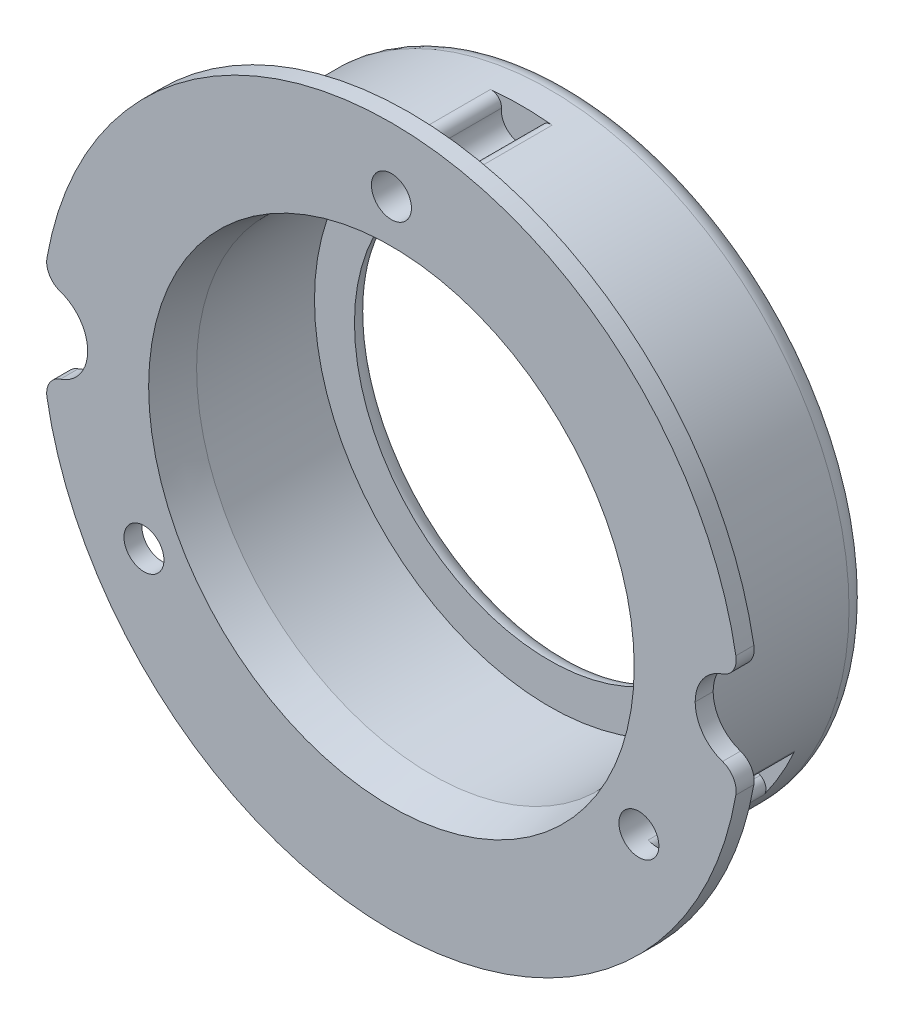
ISO-10303-21;
HEADER;
FILE_DESCRIPTION(('STEP AP214'),'2;1');
FILE_NAME('part.step','',(''),(''),'','','');
FILE_SCHEMA(('AUTOMOTIVE_DESIGN { 1 0 10303 214 1 1 1 1 }'));
ENDSEC;
DATA;
#1=APPLICATION_CONTEXT('core data for automotive mechanical design processes');
#2=APPLICATION_PROTOCOL_DEFINITION('international standard','automotive_design',2000,#1);
#3=PRODUCT_CONTEXT('',#1,'mechanical');
#4=PRODUCT('Part','Part','',(#3));
#5=PRODUCT_RELATED_PRODUCT_CATEGORY('part','',(#4));
#6=PRODUCT_DEFINITION_FORMATION('','',#4);
#7=PRODUCT_DEFINITION_CONTEXT('part definition',#1,'design');
#8=PRODUCT_DEFINITION('design','',#6,#7);
#9=PRODUCT_DEFINITION_SHAPE('','',#8);
#10=(LENGTH_UNIT() NAMED_UNIT(*) SI_UNIT(.MILLI.,.METRE.));
#11=(NAMED_UNIT(*) PLANE_ANGLE_UNIT() SI_UNIT($,.RADIAN.));
#12=(NAMED_UNIT(*) SI_UNIT($,.STERADIAN.) SOLID_ANGLE_UNIT());
#13=UNCERTAINTY_MEASURE_WITH_UNIT(LENGTH_MEASURE(1.E-05),#10,'distance_accuracy_value','');
#14=(GEOMETRIC_REPRESENTATION_CONTEXT(3) GLOBAL_UNCERTAINTY_ASSIGNED_CONTEXT((#13)) GLOBAL_UNIT_ASSIGNED_CONTEXT((#10,
#11,#12)) REPRESENTATION_CONTEXT('',''));
#15=CARTESIAN_POINT('',(0.,0.,0.));
#16=DIRECTION('',(0.,0.,1.));
#17=DIRECTION('',(1.,0.,0.));
#18=AXIS2_PLACEMENT_3D('',#15,#16,#17);
#19=CARTESIAN_POINT('',(0.,0.,4.9));
#20=DIRECTION('',(0.,0.,1.));
#21=DIRECTION('',(1.,0.,0.));
#22=AXIS2_PLACEMENT_3D('',#19,#20,#21);
#23=PLANE('',#22);
#24=CARTESIAN_POINT('',(0.,0.,4.9));
#25=DIRECTION('',(0.,0.,1.));
#26=DIRECTION('',(1.,0.,0.));
#27=AXIS2_PLACEMENT_3D('',#24,#25,#26);
#28=CIRCLE('',#27,12.15);
#29=CARTESIAN_POINT('',(12.15,0.,4.9));
#30=VERTEX_POINT('',#29);
#31=EDGE_CURVE('E11',#30,#30,#28,.F.);
#32=ORIENTED_EDGE('',*,*,#31,.T.);
#33=EDGE_LOOP('',(#32));
#34=FACE_BOUND('',#33,.T.);
#35=CARTESIAN_POINT('',(-12.3841632741175,-7.14999999999988,4.9));
#36=DIRECTION('',(0.,0.,1.));
#37=DIRECTION('',(-0.499999999999992,0.866025403784443,0.));
#38=AXIS2_PLACEMENT_3D('',#35,#36,#37);
#39=CIRCLE('',#38,1.);
#40=CARTESIAN_POINT('',(-12.8841632741175,-6.28397459621544,4.9));
#41=VERTEX_POINT('',#40);
#42=EDGE_CURVE('E473',#41,#41,#39,.T.);
#43=ORIENTED_EDGE('',*,*,#42,.F.);
#44=EDGE_LOOP('',(#43));
#45=FACE_BOUND('',#44,.T.);
#46=CARTESIAN_POINT('',(12.3841632741174,-7.15000000000006,4.9));
#47=DIRECTION('',(0.,0.,1.));
#48=DIRECTION('',(-0.500000000000004,-0.866025403784436,0.));
#49=AXIS2_PLACEMENT_3D('',#46,#47,#48);
#50=CIRCLE('',#49,1.);
#51=CARTESIAN_POINT('',(11.8841632741174,-8.0160254037845,4.9));
#52=VERTEX_POINT('',#51);
#53=EDGE_CURVE('E465',#52,#52,#50,.T.);
#54=ORIENTED_EDGE('',*,*,#53,.F.);
#55=EDGE_LOOP('',(#54));
#56=FACE_BOUND('',#55,.T.);
#57=CARTESIAN_POINT('',(0.,14.3,4.9));
#58=DIRECTION('',(0.,0.,1.));
#59=DIRECTION('',(1.,0.,0.));
#60=AXIS2_PLACEMENT_3D('',#57,#58,#59);
#61=CIRCLE('',#60,1.);
#62=CARTESIAN_POINT('',(1.,14.3,4.9));
#63=VERTEX_POINT('',#62);
#64=EDGE_CURVE('E457',#63,#63,#61,.T.);
#65=ORIENTED_EDGE('',*,*,#64,.F.);
#66=EDGE_LOOP('',(#65));
#67=FACE_BOUND('',#66,.T.);
#68=CARTESIAN_POINT('',(17.2,0.,4.9));
#69=DIRECTION('',(0.,0.,1.));
#70=DIRECTION('',(1.,0.,0.));
#71=AXIS2_PLACEMENT_3D('',#68,#69,#70);
#72=CIRCLE('',#71,2.);
#73=CARTESIAN_POINT('',(15.2,0.,4.9));
#74=VERTEX_POINT('',#73);
#75=CARTESIAN_POINT('',(16.5684108527132,1.89765517126519,4.9));
#76=VERTEX_POINT('',#75);
#77=EDGE_CURVE('E220',#74,#76,#72,.F.);
#78=ORIENTED_EDGE('',*,*,#77,.T.);
#79=CARTESIAN_POINT('',(16.2526162790698,2.84648275689778,4.9));
#80=DIRECTION('',(0.,0.,1.));
#81=DIRECTION('',(1.,0.,0.));
#82=AXIS2_PLACEMENT_3D('',#79,#80,#81);
#83=CIRCLE('',#82,1.);
#84=CARTESIAN_POINT('',(17.2376233262861,3.01899686337644,4.9));
#85=VERTEX_POINT('',#84);
#86=EDGE_CURVE('E243',#76,#85,#83,.T.);
#87=ORIENTED_EDGE('',*,*,#86,.T.);
#88=CARTESIAN_POINT('',(0.,0.,4.9));
#89=DIRECTION('',(0.,0.,1.));
#90=DIRECTION('',(1.,0.,0.));
#91=AXIS2_PLACEMENT_3D('',#88,#89,#90);
#92=CIRCLE('',#91,17.5);
#93=CARTESIAN_POINT('',(-17.2376233262861,3.01899686337644,4.9));
#94=VERTEX_POINT('',#93);
#95=EDGE_CURVE('E449',#85,#94,#92,.T.);
#96=ORIENTED_EDGE('',*,*,#95,.T.);
#97=CARTESIAN_POINT('',(-16.2526162790698,2.84648275689778,4.9));
#98=DIRECTION('',(0.,0.,1.));
#99=DIRECTION('',(1.,0.,0.));
#100=AXIS2_PLACEMENT_3D('',#97,#98,#99);
#101=CIRCLE('',#100,1.);
#102=CARTESIAN_POINT('',(-16.5684108527132,1.89765517126519,4.9));
#103=VERTEX_POINT('',#102);
#104=EDGE_CURVE('E237',#94,#103,#101,.T.);
#105=ORIENTED_EDGE('',*,*,#104,.T.);
#106=CARTESIAN_POINT('',(-17.2,0.,4.9));
#107=DIRECTION('',(0.,0.,1.));
#108=DIRECTION('',(1.,0.,0.));
#109=AXIS2_PLACEMENT_3D('',#106,#107,#108);
#110=CIRCLE('',#109,2.);
#111=CARTESIAN_POINT('',(-15.2,0.,4.9));
#112=VERTEX_POINT('',#111);
#113=EDGE_CURVE('E207',#103,#112,#110,.F.);
#114=ORIENTED_EDGE('',*,*,#113,.T.);
#115=CARTESIAN_POINT('',(-17.2,0.,4.9));
#116=DIRECTION('',(0.,0.,1.));
#117=DIRECTION('',(1.,0.,0.));
#118=AXIS2_PLACEMENT_3D('',#115,#116,#117);
#119=CIRCLE('',#118,2.);
#120=CARTESIAN_POINT('',(-16.5684108527132,-1.89765517126519,4.9));
#121=VERTEX_POINT('',#120);
#122=EDGE_CURVE('E195',#112,#121,#119,.F.);
#123=ORIENTED_EDGE('',*,*,#122,.T.);
#124=CARTESIAN_POINT('',(-16.2526162790698,-2.84648275689778,4.9));
#125=DIRECTION('',(0.,0.,1.));
#126=DIRECTION('',(1.,0.,0.));
#127=AXIS2_PLACEMENT_3D('',#124,#125,#126);
#128=CIRCLE('',#127,1.);
#129=CARTESIAN_POINT('',(-17.2376233262861,-3.01899686337644,4.9));
#130=VERTEX_POINT('',#129);
#131=EDGE_CURVE('E239',#121,#130,#128,.T.);
#132=ORIENTED_EDGE('',*,*,#131,.T.);
#133=CARTESIAN_POINT('',(17.2376233262861,-3.01899686337644,4.9));
#134=VERTEX_POINT('',#133);
#135=EDGE_CURVE('E452',#130,#134,#92,.T.);
#136=ORIENTED_EDGE('',*,*,#135,.T.);
#137=CARTESIAN_POINT('',(16.2526162790698,-2.84648275689778,4.9));
#138=DIRECTION('',(0.,0.,1.));
#139=DIRECTION('',(1.,0.,0.));
#140=AXIS2_PLACEMENT_3D('',#137,#138,#139);
#141=CIRCLE('',#140,1.);
#142=CARTESIAN_POINT('',(16.5684108527132,-1.89765517126519,4.9));
#143=VERTEX_POINT('',#142);
#144=EDGE_CURVE('E241',#134,#143,#141,.T.);
#145=ORIENTED_EDGE('',*,*,#144,.T.);
#146=CARTESIAN_POINT('',(17.2,0.,4.9));
#147=DIRECTION('',(0.,0.,1.));
#148=DIRECTION('',(1.,0.,0.));
#149=AXIS2_PLACEMENT_3D('',#146,#147,#148);
#150=CIRCLE('',#149,2.);
#151=EDGE_CURVE('E708',#143,#74,#150,.F.);
#152=ORIENTED_EDGE('',*,*,#151,.T.);
#153=EDGE_LOOP('',(#78,#87,#96,#105,#114,#123,#132,#136,#145,#152));
#154=FACE_BOUND('',#153,.T.);
#155=ADVANCED_FACE('F37',(#34,#45,#56,#67,#154),#23,.T.);
#156=CARTESIAN_POINT('',(0.,0.,4.));
#157=DIRECTION('',(0.,0.,1.));
#158=DIRECTION('',(1.,0.,0.));
#159=AXIS2_PLACEMENT_3D('',#156,#157,#158);
#160=PLANE('',#159);
#161=CARTESIAN_POINT('',(0.,14.3,4.));
#162=DIRECTION('',(0.,0.,1.));
#163=DIRECTION('',(1.,0.,0.));
#164=AXIS2_PLACEMENT_3D('',#161,#162,#163);
#165=CIRCLE('',#164,1.);
#166=CARTESIAN_POINT('',(0.996647272170034,14.3818181818182,4.));
#167=VERTEX_POINT('',#166);
#168=CARTESIAN_POINT('',(-0.996647272170033,14.3818181818182,4.));
#169=VERTEX_POINT('',#168);
#170=EDGE_CURVE('E52',#167,#169,#165,.T.);
#171=ORIENTED_EDGE('',*,*,#170,.T.);
#172=CARTESIAN_POINT('',(-1.49497090825505,14.4227272727273,4.));
#173=DIRECTION('',(0.,0.,1.));
#174=DIRECTION('',(1.,0.,0.));
#175=AXIS2_PLACEMENT_3D('',#172,#173,#174);
#176=CIRCLE('',#175,0.5);
#177=CARTESIAN_POINT('',(-1.54652162922937,14.9200626959248,4.));
#178=VERTEX_POINT('',#177);
#179=EDGE_CURVE('E315',#169,#178,#176,.T.);
#180=ORIENTED_EDGE('',*,*,#179,.T.);
#181=CARTESIAN_POINT('',(0.,0.,4.));
#182=DIRECTION('',(0.,0.,1.));
#183=DIRECTION('',(1.,0.,0.));
#184=AXIS2_PLACEMENT_3D('',#181,#182,#183);
#185=CIRCLE('',#184,15.);
#186=CARTESIAN_POINT('',(-13.6944141353421,-6.12070432954752,4.));
#187=VERTEX_POINT('',#186);
#188=EDGE_CURVE('E430',#178,#187,#185,.T.);
#189=ORIENTED_EDGE('',*,*,#188,.T.);
#190=CARTESIAN_POINT('',(-13.2379336641641,-5.91668085189594,4.));
#191=DIRECTION('',(0.,0.,1.));
#192=DIRECTION('',(1.,0.,0.));
#193=AXIS2_PLACEMENT_3D('',#190,#191,#192);
#194=CIRCLE('',#193,0.5);
#195=CARTESIAN_POINT('',(-12.9533435341485,-6.32778723459726,4.));
#196=VERTEX_POINT('',#195);
#197=EDGE_CURVE('E307',#187,#196,#194,.T.);
#198=ORIENTED_EDGE('',*,*,#197,.T.);
#199=CARTESIAN_POINT('',(-12.3841632741175,-7.14999999999988,4.));
#200=DIRECTION('',(0.,0.,1.));
#201=DIRECTION('',(1.,0.,0.));
#202=AXIS2_PLACEMENT_3D('',#199,#200,#201);
#203=CIRCLE('',#202,1.);
#204=CARTESIAN_POINT('',(-11.9566962619785,-8.05403094722069,4.));
#205=VERTEX_POINT('',#204);
#206=EDGE_CURVE('E468',#196,#205,#203,.T.);
#207=ORIENTED_EDGE('',*,*,#206,.T.);
#208=CARTESIAN_POINT('',(-11.742962755909,-8.5060464208311,4.));
#209=DIRECTION('',(0.,0.,1.));
#210=DIRECTION('',(1.,0.,0.));
#211=AXIS2_PLACEMENT_3D('',#208,#209,#210);
#212=CIRCLE('',#211,0.5);
#213=CARTESIAN_POINT('',(-12.1478925061128,-8.799358366377,4.));
#214=VERTEX_POINT('',#213);
#215=EDGE_CURVE('E305',#205,#214,#212,.T.);
#216=ORIENTED_EDGE('',*,*,#215,.T.);
#217=CARTESIAN_POINT('',(12.1478925061127,-8.79935836637717,4.));
#218=VERTEX_POINT('',#217);
#219=EDGE_CURVE('E434',#214,#218,#185,.T.);
#220=ORIENTED_EDGE('',*,*,#219,.T.);
#221=CARTESIAN_POINT('',(11.7429627559089,-8.50604642083126,4.));
#222=DIRECTION('',(0.,0.,1.));
#223=DIRECTION('',(1.,0.,0.));
#224=AXIS2_PLACEMENT_3D('',#221,#222,#223);
#225=CIRCLE('',#224,0.5);
#226=CARTESIAN_POINT('',(11.9566962619784,-8.05403094722086,4.));
#227=VERTEX_POINT('',#226);
#228=EDGE_CURVE('E293',#218,#227,#225,.T.);
#229=ORIENTED_EDGE('',*,*,#228,.T.);
#230=CARTESIAN_POINT('',(12.3841632741174,-7.15000000000006,4.));
#231=DIRECTION('',(0.,0.,1.));
#232=DIRECTION('',(1.,0.,0.));
#233=AXIS2_PLACEMENT_3D('',#230,#231,#232);
#234=CIRCLE('',#233,1.);
#235=CARTESIAN_POINT('',(12.9533435341485,-6.32778723459744,4.));
#236=VERTEX_POINT('',#235);
#237=EDGE_CURVE('E460',#227,#236,#234,.T.);
#238=ORIENTED_EDGE('',*,*,#237,.T.);
#239=CARTESIAN_POINT('',(13.237933664164,-5.91668085189612,4.));
#240=DIRECTION('',(0.,0.,1.));
#241=DIRECTION('',(1.,0.,0.));
#242=AXIS2_PLACEMENT_3D('',#239,#240,#241);
#243=CIRCLE('',#242,0.5);
#244=CARTESIAN_POINT('',(13.694414135342,-6.12070432954772,4.));
#245=VERTEX_POINT('',#244);
#246=EDGE_CURVE('E301',#236,#245,#243,.T.);
#247=ORIENTED_EDGE('',*,*,#246,.T.);
#248=CARTESIAN_POINT('',(1.54652162922937,14.9200626959248,4.));
#249=VERTEX_POINT('',#248);
#250=EDGE_CURVE('E436',#245,#249,#185,.T.);
#251=ORIENTED_EDGE('',*,*,#250,.T.);
#252=CARTESIAN_POINT('',(1.49497090825506,14.4227272727273,4.));
#253=DIRECTION('',(0.,0.,1.));
#254=DIRECTION('',(1.,0.,0.));
#255=AXIS2_PLACEMENT_3D('',#252,#253,#254);
#256=CIRCLE('',#255,0.5);
#257=EDGE_CURVE('E317',#249,#167,#256,.T.);
#258=ORIENTED_EDGE('',*,*,#257,.T.);
#259=EDGE_LOOP('',(#171,#180,#189,#198,#207,#216,#220,#229,#238,#247,#251,#258));
#260=FACE_BOUND('',#259,.T.);
#261=CARTESIAN_POINT('',(0.,0.,4.));
#262=DIRECTION('',(0.,0.,1.));
#263=DIRECTION('',(1.,0.,0.));
#264=AXIS2_PLACEMENT_3D('',#261,#262,#263);
#265=CIRCLE('',#264,17.5);
#266=CARTESIAN_POINT('',(17.2376233262861,3.01899686337644,4.));
#267=VERTEX_POINT('',#266);
#268=CARTESIAN_POINT('',(-17.2376233262861,3.01899686337644,4.));
#269=VERTEX_POINT('',#268);
#270=EDGE_CURVE('E215',#267,#269,#265,.T.);
#271=ORIENTED_EDGE('',*,*,#270,.F.);
#272=CARTESIAN_POINT('',(16.2526162790698,2.84648275689778,4.));
#273=DIRECTION('',(0.,0.,1.));
#274=DIRECTION('',(1.,0.,0.));
#275=AXIS2_PLACEMENT_3D('',#272,#273,#274);
#276=CIRCLE('',#275,1.);
#277=CARTESIAN_POINT('',(16.5684108527132,1.89765517126519,4.));
#278=VERTEX_POINT('',#277);
#279=EDGE_CURVE('E233',#267,#278,#276,.F.);
#280=ORIENTED_EDGE('',*,*,#279,.T.);
#281=CARTESIAN_POINT('',(17.2,0.,4.));
#282=DIRECTION('',(0.,0.,1.));
#283=DIRECTION('',(1.,0.,0.));
#284=AXIS2_PLACEMENT_3D('',#281,#282,#283);
#285=CIRCLE('',#284,2.);
#286=CARTESIAN_POINT('',(15.2,0.,4.));
#287=VERTEX_POINT('',#286);
#288=EDGE_CURVE('E703',#278,#287,#285,.T.);
#289=ORIENTED_EDGE('',*,*,#288,.T.);
#290=CARTESIAN_POINT('',(17.2,0.,4.));
#291=DIRECTION('',(0.,0.,1.));
#292=DIRECTION('',(1.,0.,0.));
#293=AXIS2_PLACEMENT_3D('',#290,#291,#292);
#294=CIRCLE('',#293,2.);
#295=CARTESIAN_POINT('',(16.5684108527132,-1.89765517126519,4.));
#296=VERTEX_POINT('',#295);
#297=EDGE_CURVE('E709',#287,#296,#294,.T.);
#298=ORIENTED_EDGE('',*,*,#297,.T.);
#299=CARTESIAN_POINT('',(16.2526162790698,-2.84648275689778,4.));
#300=DIRECTION('',(0.,0.,1.));
#301=DIRECTION('',(1.,0.,0.));
#302=AXIS2_PLACEMENT_3D('',#299,#300,#301);
#303=CIRCLE('',#302,1.);
#304=CARTESIAN_POINT('',(17.2376233262861,-3.01899686337644,4.));
#305=VERTEX_POINT('',#304);
#306=EDGE_CURVE('E231',#296,#305,#303,.F.);
#307=ORIENTED_EDGE('',*,*,#306,.T.);
#308=CARTESIAN_POINT('',(-17.2376233262861,-3.01899686337644,4.));
#309=VERTEX_POINT('',#308);
#310=EDGE_CURVE('E211',#309,#305,#265,.T.);
#311=ORIENTED_EDGE('',*,*,#310,.F.);
#312=CARTESIAN_POINT('',(-16.2526162790698,-2.84648275689778,4.));
#313=DIRECTION('',(0.,0.,1.));
#314=DIRECTION('',(1.,0.,0.));
#315=AXIS2_PLACEMENT_3D('',#312,#313,#314);
#316=CIRCLE('',#315,1.);
#317=CARTESIAN_POINT('',(-16.5684108527132,-1.89765517126519,4.));
#318=VERTEX_POINT('',#317);
#319=EDGE_CURVE('E190',#309,#318,#316,.F.);
#320=ORIENTED_EDGE('',*,*,#319,.T.);
#321=CARTESIAN_POINT('',(-17.2,0.,4.));
#322=DIRECTION('',(0.,0.,1.));
#323=DIRECTION('',(1.,0.,0.));
#324=AXIS2_PLACEMENT_3D('',#321,#322,#323);
#325=CIRCLE('',#324,2.);
#326=CARTESIAN_POINT('',(-15.2,0.,4.));
#327=VERTEX_POINT('',#326);
#328=EDGE_CURVE('E183',#318,#327,#325,.T.);
#329=ORIENTED_EDGE('',*,*,#328,.T.);
#330=CARTESIAN_POINT('',(-17.2,0.,4.));
#331=DIRECTION('',(0.,0.,1.));
#332=DIRECTION('',(1.,0.,0.));
#333=AXIS2_PLACEMENT_3D('',#330,#331,#332);
#334=CIRCLE('',#333,2.);
#335=CARTESIAN_POINT('',(-16.5684108527132,1.89765517126519,4.));
#336=VERTEX_POINT('',#335);
#337=EDGE_CURVE('E187',#327,#336,#334,.T.);
#338=ORIENTED_EDGE('',*,*,#337,.T.);
#339=CARTESIAN_POINT('',(-16.2526162790698,2.84648275689778,4.));
#340=DIRECTION('',(0.,0.,1.));
#341=DIRECTION('',(1.,0.,0.));
#342=AXIS2_PLACEMENT_3D('',#339,#340,#341);
#343=CIRCLE('',#342,1.);
#344=EDGE_CURVE('E228',#336,#269,#343,.F.);
#345=ORIENTED_EDGE('',*,*,#344,.T.);
#346=EDGE_LOOP('',(#271,#280,#289,#298,#307,#311,#320,#329,#338,#345));
#347=FACE_BOUND('',#346,.T.);
#348=ADVANCED_FACE('F186',(#260,#347),#160,.F.);
#349=CARTESIAN_POINT('',(0.,0.,4.9));
#350=DIRECTION('',(0.,0.,-1.));
#351=DIRECTION('',(-1.,0.,0.));
#352=AXIS2_PLACEMENT_3D('',#349,#350,#351);
#353=CYLINDRICAL_SURFACE('',#352,17.5);
#354=ORIENTED_EDGE('',*,*,#310,.T.);
#355=DIRECTION('',(0.,0.,-1.));
#356=VECTOR('',#355,1.);
#357=CARTESIAN_POINT('',(17.2376233262861,-3.01899686337644,4.9));
#358=LINE('',#357,#356);
#359=EDGE_CURVE('E247',#305,#134,#358,.F.);
#360=ORIENTED_EDGE('',*,*,#359,.T.);
#361=ORIENTED_EDGE('',*,*,#135,.F.);
#362=DIRECTION('',(0.,0.,-1.));
#363=VECTOR('',#362,1.);
#364=CARTESIAN_POINT('',(-17.2376233262861,-3.01899686337644,4.9));
#365=LINE('',#364,#363);
#366=EDGE_CURVE('E245',#130,#309,#365,.T.);
#367=ORIENTED_EDGE('',*,*,#366,.T.);
#368=EDGE_LOOP('',(#354,#360,#361,#367));
#369=FACE_BOUND('',#368,.T.);
#370=ADVANCED_FACE('F342',(#369),#353,.T.);
#371=ORIENTED_EDGE('',*,*,#95,.F.);
#372=DIRECTION('',(0.,0.,-1.));
#373=VECTOR('',#372,1.);
#374=CARTESIAN_POINT('',(17.2376233262861,3.01899686337644,4.9));
#375=LINE('',#374,#373);
#376=EDGE_CURVE('E225',#85,#267,#375,.T.);
#377=ORIENTED_EDGE('',*,*,#376,.T.);
#378=ORIENTED_EDGE('',*,*,#270,.T.);
#379=DIRECTION('',(0.,0.,-1.));
#380=VECTOR('',#379,1.);
#381=CARTESIAN_POINT('',(-17.2376233262861,3.01899686337644,4.9));
#382=LINE('',#381,#380);
#383=EDGE_CURVE('E223',#269,#94,#382,.F.);
#384=ORIENTED_EDGE('',*,*,#383,.T.);
#385=EDGE_LOOP('',(#371,#377,#378,#384));
#386=FACE_BOUND('',#385,.T.);
#387=ADVANCED_FACE('F351',(#386),#353,.T.);
#388=CARTESIAN_POINT('',(0.,0.,4.));
#389=DIRECTION('',(0.,0.,-1.));
#390=DIRECTION('',(-1.,0.,0.));
#391=AXIS2_PLACEMENT_3D('',#388,#389,#390);
#392=CYLINDRICAL_SURFACE('',#391,11.75);
#393=CARTESIAN_POINT('',(0.,0.,2.89999999999993));
#394=DIRECTION('',(0.,0.,1.));
#395=DIRECTION('',(1.,0.,0.));
#396=AXIS2_PLACEMENT_3D('',#393,#394,#395);
#397=CIRCLE('',#396,11.75);
#398=CARTESIAN_POINT('',(11.75,0.,2.89999999999993));
#399=VERTEX_POINT('',#398);
#400=EDGE_CURVE('E45',#399,#399,#397,.T.);
#401=ORIENTED_EDGE('',*,*,#400,.T.);
#402=EDGE_LOOP('',(#401));
#403=FACE_BOUND('',#402,.T.);
#404=CARTESIAN_POINT('',(0.,0.,-3.));
#405=DIRECTION('',(0.,0.,-1.));
#406=DIRECTION('',(-1.,0.,0.));
#407=AXIS2_PLACEMENT_3D('',#404,#405,#406);
#408=CIRCLE('',#407,11.75);
#409=CARTESIAN_POINT('',(-11.75,0.,-3.));
#410=VERTEX_POINT('',#409);
#411=EDGE_CURVE('E443',#410,#410,#408,.T.);
#412=ORIENTED_EDGE('',*,*,#411,.T.);
#413=EDGE_LOOP('',(#412));
#414=FACE_BOUND('',#413,.T.);
#415=ADVANCED_FACE('F324',(#403,#414),#392,.F.);
#416=CARTESIAN_POINT('',(0.,0.,-4.));
#417=DIRECTION('',(0.,0.,1.));
#418=DIRECTION('',(1.,0.,0.));
#419=AXIS2_PLACEMENT_3D('',#416,#417,#418);
#420=PLANE('',#419);
#421=CARTESIAN_POINT('',(0.,0.,-4.));
#422=DIRECTION('',(0.,0.,1.));
#423=DIRECTION('',(1.,0.,0.));
#424=AXIS2_PLACEMENT_3D('',#421,#422,#423);
#425=CIRCLE('',#424,10.75);
#426=CARTESIAN_POINT('',(10.75,0.,-4.));
#427=VERTEX_POINT('',#426);
#428=EDGE_CURVE('E196',#427,#427,#425,.T.);
#429=ORIENTED_EDGE('',*,*,#428,.T.);
#430=EDGE_LOOP('',(#429));
#431=FACE_BOUND('',#430,.T.);
#432=CARTESIAN_POINT('',(0.,0.,-4.));
#433=DIRECTION('',(0.,0.,1.));
#434=DIRECTION('',(1.,0.,0.));
#435=AXIS2_PLACEMENT_3D('',#432,#433,#434);
#436=CIRCLE('',#435,14.);
#437=CARTESIAN_POINT('',(14.,0.,-4.));
#438=VERTEX_POINT('',#437);
#439=EDGE_CURVE('E438',#438,#438,#436,.F.);
#440=ORIENTED_EDGE('',*,*,#439,.T.);
#441=EDGE_LOOP('',(#440));
#442=FACE_BOUND('',#441,.T.);
#443=ADVANCED_FACE('F361',(#431,#442),#420,.F.);
#444=CARTESIAN_POINT('',(0.,0.,4.));
#445=DIRECTION('',(0.,0.,-1.));
#446=DIRECTION('',(-1.,0.,0.));
#447=AXIS2_PLACEMENT_3D('',#444,#445,#446);
#448=CYLINDRICAL_SURFACE('',#447,15.);
#449=CARTESIAN_POINT('',(0.,0.,-3.));
#450=DIRECTION('',(0.,0.,1.));
#451=DIRECTION('',(1.,0.,0.));
#452=AXIS2_PLACEMENT_3D('',#449,#450,#451);
#453=CIRCLE('',#452,15.);
#454=CARTESIAN_POINT('',(15.,0.,-3.));
#455=VERTEX_POINT('',#454);
#456=EDGE_CURVE('E433',#455,#455,#453,.T.);
#457=ORIENTED_EDGE('',*,*,#456,.T.);
#458=EDGE_LOOP('',(#457));
#459=FACE_BOUND('',#458,.T.);
#460=CARTESIAN_POINT('',(0.,0.,-1.6));
#461=DIRECTION('',(0.,0.,1.));
#462=DIRECTION('',(1.,0.,0.));
#463=AXIS2_PLACEMENT_3D('',#460,#461,#462);
#464=CIRCLE('',#463,15.);
#465=CARTESIAN_POINT('',(12.1478925061127,-8.79935836637717,-1.6));
#466=VERTEX_POINT('',#465);
#467=CARTESIAN_POINT('',(13.694414135342,-6.12070432954772,-1.6));
#468=VERTEX_POINT('',#467);
#469=EDGE_CURVE('E257',#466,#468,#464,.T.);
#470=ORIENTED_EDGE('',*,*,#469,.F.);
#471=DIRECTION('',(0.,0.,-1.));
#472=VECTOR('',#471,1.);
#473=CARTESIAN_POINT('',(12.1478925061127,-8.79935836637717,4.));
#474=LINE('',#473,#472);
#475=EDGE_CURVE('E276',#466,#218,#474,.F.);
#476=ORIENTED_EDGE('',*,*,#475,.T.);
#477=ORIENTED_EDGE('',*,*,#219,.F.);
#478=DIRECTION('',(0.,0.,-1.));
#479=VECTOR('',#478,1.);
#480=CARTESIAN_POINT('',(-12.1478925061128,-8.799358366377,4.));
#481=LINE('',#480,#479);
#482=CARTESIAN_POINT('',(-12.1478925061128,-8.799358366377,-1.6));
#483=VERTEX_POINT('',#482);
#484=EDGE_CURVE('E270',#214,#483,#481,.T.);
#485=ORIENTED_EDGE('',*,*,#484,.T.);
#486=CARTESIAN_POINT('',(0.,0.,-1.6));
#487=DIRECTION('',(0.,0.,1.));
#488=DIRECTION('',(1.,0.,0.));
#489=AXIS2_PLACEMENT_3D('',#486,#487,#488);
#490=CIRCLE('',#489,15.);
#491=CARTESIAN_POINT('',(-13.6944141353421,-6.12070432954752,-1.6));
#492=VERTEX_POINT('',#491);
#493=EDGE_CURVE('E259',#492,#483,#490,.T.);
#494=ORIENTED_EDGE('',*,*,#493,.F.);
#495=DIRECTION('',(0.,0.,-1.));
#496=VECTOR('',#495,1.);
#497=CARTESIAN_POINT('',(-13.6944141353421,-6.12070432954752,4.));
#498=LINE('',#497,#496);
#499=EDGE_CURVE('E267',#492,#187,#498,.F.);
#500=ORIENTED_EDGE('',*,*,#499,.T.);
#501=ORIENTED_EDGE('',*,*,#188,.F.);
#502=DIRECTION('',(0.,0.,-1.));
#503=VECTOR('',#502,1.);
#504=CARTESIAN_POINT('',(-1.54652162922937,14.9200626959248,4.));
#505=LINE('',#504,#503);
#506=CARTESIAN_POINT('',(-1.54652162922937,14.9200626959248,-1.6));
#507=VERTEX_POINT('',#506);
#508=EDGE_CURVE('E264',#178,#507,#505,.T.);
#509=ORIENTED_EDGE('',*,*,#508,.T.);
#510=CARTESIAN_POINT('',(0.,0.,-1.6));
#511=DIRECTION('',(0.,0.,1.));
#512=DIRECTION('',(1.,0.,0.));
#513=AXIS2_PLACEMENT_3D('',#510,#511,#512);
#514=CIRCLE('',#513,15.);
#515=CARTESIAN_POINT('',(1.54652162922937,14.9200626959248,-1.6));
#516=VERTEX_POINT('',#515);
#517=EDGE_CURVE('E255',#516,#507,#514,.T.);
#518=ORIENTED_EDGE('',*,*,#517,.F.);
#519=DIRECTION('',(0.,0.,-1.));
#520=VECTOR('',#519,1.);
#521=CARTESIAN_POINT('',(1.54652162922937,14.9200626959248,4.));
#522=LINE('',#521,#520);
#523=EDGE_CURVE('E261',#516,#249,#522,.F.);
#524=ORIENTED_EDGE('',*,*,#523,.T.);
#525=ORIENTED_EDGE('',*,*,#250,.F.);
#526=DIRECTION('',(0.,0.,-1.));
#527=VECTOR('',#526,1.);
#528=CARTESIAN_POINT('',(13.694414135342,-6.12070432954772,4.));
#529=LINE('',#528,#527);
#530=EDGE_CURVE('E273',#245,#468,#529,.T.);
#531=ORIENTED_EDGE('',*,*,#530,.T.);
#532=EDGE_LOOP('',(#470,#476,#477,#485,#494,#500,#501,#509,#518,#524,#525,#531));
#533=FACE_BOUND('',#532,.T.);
#534=ADVANCED_FACE('F357',(#459,#533),#448,.T.);
#535=CARTESIAN_POINT('',(0.,0.,-3.));
#536=DIRECTION('',(0.,0.,-1.));
#537=DIRECTION('',(-1.,0.,0.));
#538=AXIS2_PLACEMENT_3D('',#535,#536,#537);
#539=PLANE('',#538);
#540=CARTESIAN_POINT('',(0.,0.,-3.));
#541=DIRECTION('',(0.,0.,-1.));
#542=DIRECTION('',(-1.,0.,0.));
#543=AXIS2_PLACEMENT_3D('',#540,#541,#542);
#544=CIRCLE('',#543,9.75);
#545=CARTESIAN_POINT('',(-9.75,0.,-3.));
#546=VERTEX_POINT('',#545);
#547=EDGE_CURVE('E446',#546,#546,#544,.T.);
#548=ORIENTED_EDGE('',*,*,#547,.T.);
#549=EDGE_LOOP('',(#548));
#550=FACE_BOUND('',#549,.T.);
#551=ORIENTED_EDGE('',*,*,#411,.F.);
#552=EDGE_LOOP('',(#551));
#553=FACE_BOUND('',#552,.T.);
#554=ADVANCED_FACE('F353',(#550,#553),#539,.F.);
#555=CARTESIAN_POINT('',(0.,0.,-3.));
#556=DIRECTION('',(0.,0.,1.));
#557=DIRECTION('',(1.,0.,0.));
#558=AXIS2_PLACEMENT_3D('',#555,#556,#557);
#559=TOROIDAL_SURFACE('',#558,14.,1.);
#560=ORIENTED_EDGE('',*,*,#439,.F.);
#561=EDGE_LOOP('',(#560));
#562=FACE_BOUND('',#561,.T.);
#563=ORIENTED_EDGE('',*,*,#456,.F.);
#564=EDGE_LOOP('',(#563));
#565=FACE_BOUND('',#564,.T.);
#566=ADVANCED_FACE('F356',(#562,#565),#559,.T.);
#567=CARTESIAN_POINT('',(0.,0.,-3.));
#568=DIRECTION('',(0.,0.,1.));
#569=DIRECTION('',(1.,0.,0.));
#570=AXIS2_PLACEMENT_3D('',#567,#568,#569);
#571=TOROIDAL_SURFACE('',#570,10.75,1.);
#572=ORIENTED_EDGE('',*,*,#428,.F.);
#573=EDGE_LOOP('',(#572));
#574=FACE_BOUND('',#573,.T.);
#575=ORIENTED_EDGE('',*,*,#547,.F.);
#576=EDGE_LOOP('',(#575));
#577=FACE_BOUND('',#576,.T.);
#578=ADVANCED_FACE('F370',(#574,#577),#571,.T.);
#579=CARTESIAN_POINT('',(-17.2,0.,4.9));
#580=DIRECTION('',(0.,0.,-1.));
#581=DIRECTION('',(-1.,0.,0.));
#582=AXIS2_PLACEMENT_3D('',#579,#580,#581);
#583=CYLINDRICAL_SURFACE('',#582,2.);
#584=ORIENTED_EDGE('',*,*,#113,.F.);
#585=DIRECTION('',(0.,0.,-1.));
#586=VECTOR('',#585,1.);
#587=CARTESIAN_POINT('',(-16.5684108527132,1.89765517126519,4.9));
#588=LINE('',#587,#586);
#589=EDGE_CURVE('E206',#103,#336,#588,.T.);
#590=ORIENTED_EDGE('',*,*,#589,.T.);
#591=ORIENTED_EDGE('',*,*,#337,.F.);
#592=DIRECTION('',(0.,0.,-1.));
#593=VECTOR('',#592,1.);
#594=CARTESIAN_POINT('',(-15.2,0.,4.9));
#595=LINE('',#594,#593);
#596=EDGE_CURVE('E203',#112,#327,#595,.T.);
#597=ORIENTED_EDGE('',*,*,#596,.F.);
#598=EDGE_LOOP('',(#584,#590,#591,#597));
#599=FACE_BOUND('',#598,.T.);
#600=ADVANCED_FACE('F202',(#599),#583,.F.);
#601=CARTESIAN_POINT('',(-17.2,0.,4.9));
#602=DIRECTION('',(0.,0.,-1.));
#603=DIRECTION('',(-1.,0.,0.));
#604=AXIS2_PLACEMENT_3D('',#601,#602,#603);
#605=CYLINDRICAL_SURFACE('',#604,2.);
#606=ORIENTED_EDGE('',*,*,#328,.F.);
#607=DIRECTION('',(0.,0.,-1.));
#608=VECTOR('',#607,1.);
#609=CARTESIAN_POINT('',(-16.5684108527132,-1.89765517126519,4.9));
#610=LINE('',#609,#608);
#611=EDGE_CURVE('E252',#318,#121,#610,.F.);
#612=ORIENTED_EDGE('',*,*,#611,.T.);
#613=ORIENTED_EDGE('',*,*,#122,.F.);
#614=ORIENTED_EDGE('',*,*,#596,.T.);
#615=EDGE_LOOP('',(#606,#612,#613,#614));
#616=FACE_BOUND('',#615,.T.);
#617=ADVANCED_FACE('F209',(#616),#605,.F.);
#618=CARTESIAN_POINT('',(17.2,0.,4.9));
#619=DIRECTION('',(0.,0.,-1.));
#620=DIRECTION('',(-1.,0.,0.));
#621=AXIS2_PLACEMENT_3D('',#618,#619,#620);
#622=CYLINDRICAL_SURFACE('',#621,2.);
#623=ORIENTED_EDGE('',*,*,#288,.F.);
#624=DIRECTION('',(0.,0.,-1.));
#625=VECTOR('',#624,1.);
#626=CARTESIAN_POINT('',(16.5684108527132,1.89765517126519,4.9));
#627=LINE('',#626,#625);
#628=EDGE_CURVE('E235',#278,#76,#627,.F.);
#629=ORIENTED_EDGE('',*,*,#628,.T.);
#630=ORIENTED_EDGE('',*,*,#77,.F.);
#631=DIRECTION('',(0.,0.,-1.));
#632=VECTOR('',#631,1.);
#633=CARTESIAN_POINT('',(15.2,0.,4.9));
#634=LINE('',#633,#632);
#635=EDGE_CURVE('E212',#287,#74,#634,.F.);
#636=ORIENTED_EDGE('',*,*,#635,.F.);
#637=EDGE_LOOP('',(#623,#629,#630,#636));
#638=FACE_BOUND('',#637,.T.);
#639=ADVANCED_FACE('F377',(#638),#622,.F.);
#640=CARTESIAN_POINT('',(17.2,0.,4.9));
#641=DIRECTION('',(0.,0.,-1.));
#642=DIRECTION('',(-1.,0.,0.));
#643=AXIS2_PLACEMENT_3D('',#640,#641,#642);
#644=CYLINDRICAL_SURFACE('',#643,2.);
#645=ORIENTED_EDGE('',*,*,#151,.F.);
#646=DIRECTION('',(0.,0.,-1.));
#647=VECTOR('',#646,1.);
#648=CARTESIAN_POINT('',(16.5684108527132,-1.89765517126519,4.9));
#649=LINE('',#648,#647);
#650=EDGE_CURVE('E250',#143,#296,#649,.T.);
#651=ORIENTED_EDGE('',*,*,#650,.T.);
#652=ORIENTED_EDGE('',*,*,#297,.F.);
#653=ORIENTED_EDGE('',*,*,#635,.T.);
#654=EDGE_LOOP('',(#645,#651,#652,#653));
#655=FACE_BOUND('',#654,.T.);
#656=ADVANCED_FACE('F380',(#655),#644,.F.);
#657=CARTESIAN_POINT('',(16.2526162790698,2.84648275689778,4.9));
#658=DIRECTION('',(0.,0.,1.));
#659=DIRECTION('',(1.,0.,0.));
#660=AXIS2_PLACEMENT_3D('',#657,#658,#659);
#661=CYLINDRICAL_SURFACE('',#660,1.);
#662=ORIENTED_EDGE('',*,*,#86,.F.);
#663=ORIENTED_EDGE('',*,*,#628,.F.);
#664=ORIENTED_EDGE('',*,*,#279,.F.);
#665=ORIENTED_EDGE('',*,*,#376,.F.);
#666=EDGE_LOOP('',(#662,#663,#664,#665));
#667=FACE_BOUND('',#666,.T.);
#668=ADVANCED_FACE('F383',(#667),#661,.T.);
#669=CARTESIAN_POINT('',(16.2526162790698,-2.84648275689778,4.9));
#670=DIRECTION('',(0.,0.,-1.));
#671=DIRECTION('',(-1.,0.,0.));
#672=AXIS2_PLACEMENT_3D('',#669,#670,#671);
#673=CYLINDRICAL_SURFACE('',#672,1.);
#674=ORIENTED_EDGE('',*,*,#306,.F.);
#675=ORIENTED_EDGE('',*,*,#650,.F.);
#676=ORIENTED_EDGE('',*,*,#144,.F.);
#677=ORIENTED_EDGE('',*,*,#359,.F.);
#678=EDGE_LOOP('',(#674,#675,#676,#677));
#679=FACE_BOUND('',#678,.T.);
#680=ADVANCED_FACE('F390',(#679),#673,.T.);
#681=CARTESIAN_POINT('',(-16.2526162790698,-2.84648275689778,4.9));
#682=DIRECTION('',(0.,0.,-1.));
#683=DIRECTION('',(-1.,0.,0.));
#684=AXIS2_PLACEMENT_3D('',#681,#682,#683);
#685=CYLINDRICAL_SURFACE('',#684,1.);
#686=ORIENTED_EDGE('',*,*,#319,.F.);
#687=ORIENTED_EDGE('',*,*,#366,.F.);
#688=ORIENTED_EDGE('',*,*,#131,.F.);
#689=ORIENTED_EDGE('',*,*,#611,.F.);
#690=EDGE_LOOP('',(#686,#687,#688,#689));
#691=FACE_BOUND('',#690,.T.);
#692=ADVANCED_FACE('F394',(#691),#685,.T.);
#693=CARTESIAN_POINT('',(-16.2526162790698,2.84648275689778,4.9));
#694=DIRECTION('',(0.,0.,1.));
#695=DIRECTION('',(1.,0.,0.));
#696=AXIS2_PLACEMENT_3D('',#693,#694,#695);
#697=CYLINDRICAL_SURFACE('',#696,1.);
#698=ORIENTED_EDGE('',*,*,#104,.F.);
#699=ORIENTED_EDGE('',*,*,#383,.F.);
#700=ORIENTED_EDGE('',*,*,#344,.F.);
#701=ORIENTED_EDGE('',*,*,#589,.F.);
#702=EDGE_LOOP('',(#698,#699,#700,#701));
#703=FACE_BOUND('',#702,.T.);
#704=ADVANCED_FACE('F398',(#703),#697,.T.);
#705=CARTESIAN_POINT('',(0.,14.3,-1.6));
#706=DIRECTION('',(0.,0.,1.));
#707=DIRECTION('',(1.,0.,0.));
#708=AXIS2_PLACEMENT_3D('',#705,#706,#707);
#709=CYLINDRICAL_SURFACE('',#708,1.);
#710=ORIENTED_EDGE('',*,*,#64,.T.);
#711=EDGE_LOOP('',(#710));
#712=FACE_BOUND('',#711,.T.);
#713=CARTESIAN_POINT('',(0.,14.3,-1.6));
#714=DIRECTION('',(0.,0.,1.));
#715=DIRECTION('',(1.,0.,0.));
#716=AXIS2_PLACEMENT_3D('',#713,#714,#715);
#717=CIRCLE('',#716,1.);
#718=CARTESIAN_POINT('',(-0.996647272170033,14.3818181818182,-1.6));
#719=VERTEX_POINT('',#718);
#720=CARTESIAN_POINT('',(0.996647272170034,14.3818181818182,-1.6));
#721=VERTEX_POINT('',#720);
#722=EDGE_CURVE('E456',#719,#721,#717,.T.);
#723=ORIENTED_EDGE('',*,*,#722,.F.);
#724=DIRECTION('',(0.,0.,1.));
#725=VECTOR('',#724,1.);
#726=CARTESIAN_POINT('',(-0.996647272170033,14.3818181818182,-1.6));
#727=LINE('',#726,#725);
#728=EDGE_CURVE('E291',#719,#169,#727,.T.);
#729=ORIENTED_EDGE('',*,*,#728,.T.);
#730=ORIENTED_EDGE('',*,*,#170,.F.);
#731=DIRECTION('',(0.,0.,1.));
#732=VECTOR('',#731,1.);
#733=CARTESIAN_POINT('',(0.996647272170034,14.3818181818182,-1.6));
#734=LINE('',#733,#732);
#735=EDGE_CURVE('E289',#167,#721,#734,.F.);
#736=ORIENTED_EDGE('',*,*,#735,.T.);
#737=EDGE_LOOP('',(#723,#729,#730,#736));
#738=FACE_BOUND('',#737,.T.);
#739=ADVANCED_FACE('F346',(#712,#738),#709,.F.);
#740=CARTESIAN_POINT('',(0.,14.3,-1.6));
#741=DIRECTION('',(0.,0.,1.));
#742=DIRECTION('',(1.,0.,0.));
#743=AXIS2_PLACEMENT_3D('',#740,#741,#742);
#744=PLANE('',#743);
#745=ORIENTED_EDGE('',*,*,#517,.T.);
#746=CARTESIAN_POINT('',(-1.49497090825505,14.4227272727273,-1.6));
#747=DIRECTION('',(0.,0.,1.));
#748=DIRECTION('',(1.,0.,0.));
#749=AXIS2_PLACEMENT_3D('',#746,#747,#748);
#750=CIRCLE('',#749,0.5);
#751=EDGE_CURVE('E313',#507,#719,#750,.F.);
#752=ORIENTED_EDGE('',*,*,#751,.T.);
#753=ORIENTED_EDGE('',*,*,#722,.T.);
#754=CARTESIAN_POINT('',(1.49497090825506,14.4227272727273,-1.6));
#755=DIRECTION('',(0.,0.,1.));
#756=DIRECTION('',(1.,0.,0.));
#757=AXIS2_PLACEMENT_3D('',#754,#755,#756);
#758=CIRCLE('',#757,0.5);
#759=EDGE_CURVE('E319',#721,#516,#758,.F.);
#760=ORIENTED_EDGE('',*,*,#759,.T.);
#761=EDGE_LOOP('',(#745,#752,#753,#760));
#762=FACE_BOUND('',#761,.T.);
#763=ADVANCED_FACE('F505',(#762),#744,.T.);
#764=CARTESIAN_POINT('',(12.3841632741174,-7.15000000000006,-1.6));
#765=DIRECTION('',(0.,0.,1.));
#766=DIRECTION('',(1.,0.,0.));
#767=AXIS2_PLACEMENT_3D('',#764,#765,#766);
#768=CYLINDRICAL_SURFACE('',#767,1.);
#769=ORIENTED_EDGE('',*,*,#53,.T.);
#770=EDGE_LOOP('',(#769));
#771=FACE_BOUND('',#770,.T.);
#772=ORIENTED_EDGE('',*,*,#237,.F.);
#773=DIRECTION('',(0.,0.,1.));
#774=VECTOR('',#773,1.);
#775=CARTESIAN_POINT('',(11.9566962619784,-8.05403094722086,-1.6));
#776=LINE('',#775,#774);
#777=CARTESIAN_POINT('',(11.9566962619784,-8.05403094722086,-1.6));
#778=VERTEX_POINT('',#777);
#779=EDGE_CURVE('E282',#227,#778,#776,.F.);
#780=ORIENTED_EDGE('',*,*,#779,.T.);
#781=CARTESIAN_POINT('',(12.3841632741174,-7.15000000000006,-1.6));
#782=DIRECTION('',(0.,0.,1.));
#783=DIRECTION('',(-0.500000000000004,-0.866025403784436,0.));
#784=AXIS2_PLACEMENT_3D('',#781,#782,#783);
#785=CIRCLE('',#784,1.);
#786=CARTESIAN_POINT('',(12.9533435341485,-6.32778723459744,-1.6));
#787=VERTEX_POINT('',#786);
#788=EDGE_CURVE('E464',#787,#778,#785,.T.);
#789=ORIENTED_EDGE('',*,*,#788,.F.);
#790=DIRECTION('',(0.,0.,1.));
#791=VECTOR('',#790,1.);
#792=CARTESIAN_POINT('',(12.9533435341485,-6.32778723459744,-1.6));
#793=LINE('',#792,#791);
#794=EDGE_CURVE('E279',#787,#236,#793,.T.);
#795=ORIENTED_EDGE('',*,*,#794,.T.);
#796=EDGE_LOOP('',(#772,#780,#789,#795));
#797=FACE_BOUND('',#796,.T.);
#798=ADVANCED_FACE('F493',(#771,#797),#768,.F.);
#799=CARTESIAN_POINT('',(12.3841632741174,-7.15000000000006,-1.6));
#800=DIRECTION('',(0.,0.,1.));
#801=DIRECTION('',(-0.500000000000004,-0.866025403784436,0.));
#802=AXIS2_PLACEMENT_3D('',#799,#800,#801);
#803=PLANE('',#802);
#804=ORIENTED_EDGE('',*,*,#469,.T.);
#805=CARTESIAN_POINT('',(13.237933664164,-5.91668085189612,-1.6));
#806=DIRECTION('',(0.,0.,1.));
#807=DIRECTION('',(1.,0.,0.));
#808=AXIS2_PLACEMENT_3D('',#805,#806,#807);
#809=CIRCLE('',#808,0.5);
#810=EDGE_CURVE('E299',#468,#787,#809,.F.);
#811=ORIENTED_EDGE('',*,*,#810,.T.);
#812=ORIENTED_EDGE('',*,*,#788,.T.);
#813=CARTESIAN_POINT('',(11.7429627559089,-8.50604642083126,-1.6));
#814=DIRECTION('',(0.,0.,1.));
#815=DIRECTION('',(1.,0.,0.));
#816=AXIS2_PLACEMENT_3D('',#813,#814,#815);
#817=CIRCLE('',#816,0.5);
#818=EDGE_CURVE('E296',#778,#466,#817,.F.);
#819=ORIENTED_EDGE('',*,*,#818,.T.);
#820=EDGE_LOOP('',(#804,#811,#812,#819));
#821=FACE_BOUND('',#820,.T.);
#822=ADVANCED_FACE('F496',(#821),#803,.T.);
#823=CARTESIAN_POINT('',(-12.3841632741175,-7.14999999999988,-1.6));
#824=DIRECTION('',(0.,0.,1.));
#825=DIRECTION('',(1.,0.,0.));
#826=AXIS2_PLACEMENT_3D('',#823,#824,#825);
#827=CYLINDRICAL_SURFACE('',#826,1.);
#828=ORIENTED_EDGE('',*,*,#42,.T.);
#829=EDGE_LOOP('',(#828));
#830=FACE_BOUND('',#829,.T.);
#831=CARTESIAN_POINT('',(-12.3841632741175,-7.14999999999988,-1.6));
#832=DIRECTION('',(0.,0.,1.));
#833=DIRECTION('',(-0.499999999999992,0.866025403784443,0.));
#834=AXIS2_PLACEMENT_3D('',#831,#832,#833);
#835=CIRCLE('',#834,1.);
#836=CARTESIAN_POINT('',(-11.9566962619785,-8.05403094722069,-1.6));
#837=VERTEX_POINT('',#836);
#838=CARTESIAN_POINT('',(-12.9533435341485,-6.32778723459726,-1.6));
#839=VERTEX_POINT('',#838);
#840=EDGE_CURVE('E472',#837,#839,#835,.T.);
#841=ORIENTED_EDGE('',*,*,#840,.F.);
#842=DIRECTION('',(0.,0.,1.));
#843=VECTOR('',#842,1.);
#844=CARTESIAN_POINT('',(-11.9566962619785,-8.05403094722069,-1.6));
#845=LINE('',#844,#843);
#846=EDGE_CURVE('E286',#837,#205,#845,.T.);
#847=ORIENTED_EDGE('',*,*,#846,.T.);
#848=ORIENTED_EDGE('',*,*,#206,.F.);
#849=DIRECTION('',(0.,0.,1.));
#850=VECTOR('',#849,1.);
#851=CARTESIAN_POINT('',(-12.9533435341485,-6.32778723459726,-1.6));
#852=LINE('',#851,#850);
#853=EDGE_CURVE('E284',#196,#839,#852,.F.);
#854=ORIENTED_EDGE('',*,*,#853,.T.);
#855=EDGE_LOOP('',(#841,#847,#848,#854));
#856=FACE_BOUND('',#855,.T.);
#857=ADVANCED_FACE('F486',(#830,#856),#827,.F.);
#858=CARTESIAN_POINT('',(-12.3841632741175,-7.14999999999988,-1.6));
#859=DIRECTION('',(0.,0.,1.));
#860=DIRECTION('',(-0.499999999999992,0.866025403784443,0.));
#861=AXIS2_PLACEMENT_3D('',#858,#859,#860);
#862=PLANE('',#861);
#863=ORIENTED_EDGE('',*,*,#493,.T.);
#864=CARTESIAN_POINT('',(-11.742962755909,-8.5060464208311,-1.6));
#865=DIRECTION('',(0.,0.,1.));
#866=DIRECTION('',(1.,0.,0.));
#867=AXIS2_PLACEMENT_3D('',#864,#865,#866);
#868=CIRCLE('',#867,0.5);
#869=EDGE_CURVE('E303',#483,#837,#868,.F.);
#870=ORIENTED_EDGE('',*,*,#869,.T.);
#871=ORIENTED_EDGE('',*,*,#840,.T.);
#872=CARTESIAN_POINT('',(-13.2379336641641,-5.91668085189594,-1.6));
#873=DIRECTION('',(0.,0.,1.));
#874=DIRECTION('',(1.,0.,0.));
#875=AXIS2_PLACEMENT_3D('',#872,#873,#874);
#876=CIRCLE('',#875,0.5);
#877=EDGE_CURVE('E310',#839,#492,#876,.F.);
#878=ORIENTED_EDGE('',*,*,#877,.T.);
#879=EDGE_LOOP('',(#863,#870,#871,#878));
#880=FACE_BOUND('',#879,.T.);
#881=ADVANCED_FACE('F407',(#880),#862,.T.);
#882=CARTESIAN_POINT('',(11.7429627559089,-8.50604642083126,-1.6));
#883=DIRECTION('',(0.,0.,-1.));
#884=DIRECTION('',(-1.,0.,0.));
#885=AXIS2_PLACEMENT_3D('',#882,#883,#884);
#886=CYLINDRICAL_SURFACE('',#885,0.5);
#887=ORIENTED_EDGE('',*,*,#818,.F.);
#888=ORIENTED_EDGE('',*,*,#779,.F.);
#889=ORIENTED_EDGE('',*,*,#228,.F.);
#890=ORIENTED_EDGE('',*,*,#475,.F.);
#891=EDGE_LOOP('',(#887,#888,#889,#890));
#892=FACE_BOUND('',#891,.T.);
#893=ADVANCED_FACE('F403',(#892),#886,.T.);
#894=CARTESIAN_POINT('',(13.237933664164,-5.91668085189612,-1.6));
#895=DIRECTION('',(0.,0.,1.));
#896=DIRECTION('',(1.,0.,0.));
#897=AXIS2_PLACEMENT_3D('',#894,#895,#896);
#898=CYLINDRICAL_SURFACE('',#897,0.5);
#899=ORIENTED_EDGE('',*,*,#246,.F.);
#900=ORIENTED_EDGE('',*,*,#794,.F.);
#901=ORIENTED_EDGE('',*,*,#810,.F.);
#902=ORIENTED_EDGE('',*,*,#530,.F.);
#903=EDGE_LOOP('',(#899,#900,#901,#902));
#904=FACE_BOUND('',#903,.T.);
#905=ADVANCED_FACE('F406',(#904),#898,.T.);
#906=CARTESIAN_POINT('',(-11.742962755909,-8.5060464208311,-1.6));
#907=DIRECTION('',(0.,0.,1.));
#908=DIRECTION('',(1.,0.,0.));
#909=AXIS2_PLACEMENT_3D('',#906,#907,#908);
#910=CYLINDRICAL_SURFACE('',#909,0.5);
#911=ORIENTED_EDGE('',*,*,#215,.F.);
#912=ORIENTED_EDGE('',*,*,#846,.F.);
#913=ORIENTED_EDGE('',*,*,#869,.F.);
#914=ORIENTED_EDGE('',*,*,#484,.F.);
#915=EDGE_LOOP('',(#911,#912,#913,#914));
#916=FACE_BOUND('',#915,.T.);
#917=ADVANCED_FACE('F411',(#916),#910,.T.);
#918=CARTESIAN_POINT('',(-13.2379336641641,-5.91668085189594,-1.6));
#919=DIRECTION('',(0.,0.,-1.));
#920=DIRECTION('',(-1.,0.,0.));
#921=AXIS2_PLACEMENT_3D('',#918,#919,#920);
#922=CYLINDRICAL_SURFACE('',#921,0.5);
#923=ORIENTED_EDGE('',*,*,#877,.F.);
#924=ORIENTED_EDGE('',*,*,#853,.F.);
#925=ORIENTED_EDGE('',*,*,#197,.F.);
#926=ORIENTED_EDGE('',*,*,#499,.F.);
#927=EDGE_LOOP('',(#923,#924,#925,#926));
#928=FACE_BOUND('',#927,.T.);
#929=ADVANCED_FACE('F415',(#928),#922,.T.);
#930=CARTESIAN_POINT('',(-1.49497090825505,14.4227272727273,-1.6));
#931=DIRECTION('',(0.,0.,1.));
#932=DIRECTION('',(1.,0.,0.));
#933=AXIS2_PLACEMENT_3D('',#930,#931,#932);
#934=CYLINDRICAL_SURFACE('',#933,0.5);
#935=ORIENTED_EDGE('',*,*,#179,.F.);
#936=ORIENTED_EDGE('',*,*,#728,.F.);
#937=ORIENTED_EDGE('',*,*,#751,.F.);
#938=ORIENTED_EDGE('',*,*,#508,.F.);
#939=EDGE_LOOP('',(#935,#936,#937,#938));
#940=FACE_BOUND('',#939,.T.);
#941=ADVANCED_FACE('F333',(#940),#934,.T.);
#942=CARTESIAN_POINT('',(1.49497090825506,14.4227272727273,-1.6));
#943=DIRECTION('',(0.,0.,-1.));
#944=DIRECTION('',(-1.,0.,0.));
#945=AXIS2_PLACEMENT_3D('',#942,#943,#944);
#946=CYLINDRICAL_SURFACE('',#945,0.5);
#947=ORIENTED_EDGE('',*,*,#759,.F.);
#948=ORIENTED_EDGE('',*,*,#735,.F.);
#949=ORIENTED_EDGE('',*,*,#257,.F.);
#950=ORIENTED_EDGE('',*,*,#523,.F.);
#951=EDGE_LOOP('',(#947,#948,#949,#950));
#952=FACE_BOUND('',#951,.T.);
#953=ADVANCED_FACE('F328',(#952),#946,.T.);
#954=CARTESIAN_POINT('',(0.,0.,2.89999999999993));
#955=DIRECTION('',(0.,0.,1.));
#956=DIRECTION('',(1.,0.,0.));
#957=AXIS2_PLACEMENT_3D('',#954,#955,#956);
#958=CONICAL_SURFACE('',#957,11.75,0.197395559849877);
#959=ORIENTED_EDGE('',*,*,#31,.F.);
#960=EDGE_LOOP('',(#959));
#961=FACE_BOUND('',#960,.T.);
#962=ORIENTED_EDGE('',*,*,#400,.F.);
#963=EDGE_LOOP('',(#962));
#964=FACE_BOUND('',#963,.T.);
#965=ADVANCED_FACE('F39',(#961,#964),#958,.F.);
#966=CLOSED_SHELL('',(#155,#348,#370,#387,#415,#443,#534,#554,#566,#578,#600,#617,#639,#656,
#668,#680,#692,#704,#739,#763,#798,#822,#857,#881,#893,#905,#917,#929,#941,#953,#965));
#967=MANIFOLD_SOLID_BREP('B2',#966);
#968=ADVANCED_BREP_SHAPE_REPRESENTATION('',(#18,#967),#14);
#969=SHAPE_DEFINITION_REPRESENTATION(#9,#968);
ENDSEC;
END-ISO-10303-21;
